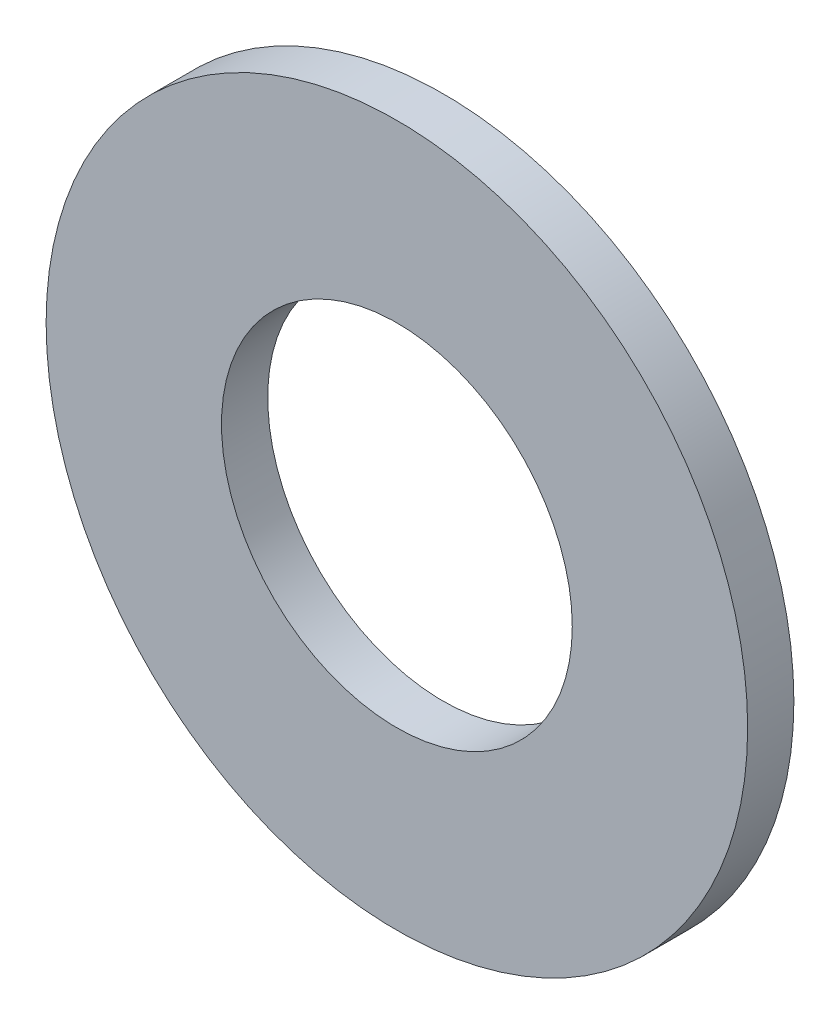
ISO-10303-21;
HEADER;
FILE_DESCRIPTION(('STEP AP214'),'2;1');
FILE_NAME('part.step','',(''),(''),'','','');
FILE_SCHEMA(('AUTOMOTIVE_DESIGN { 1 0 10303 214 1 1 1 1 }'));
ENDSEC;
DATA;
#1=APPLICATION_CONTEXT('core data for automotive mechanical design processes');
#2=APPLICATION_PROTOCOL_DEFINITION('international standard','automotive_design',2000,#1);
#3=PRODUCT_CONTEXT('',#1,'mechanical');
#4=PRODUCT('Part','Part','',(#3));
#5=PRODUCT_RELATED_PRODUCT_CATEGORY('part','',(#4));
#6=PRODUCT_DEFINITION_FORMATION('','',#4);
#7=PRODUCT_DEFINITION_CONTEXT('part definition',#1,'design');
#8=PRODUCT_DEFINITION('design','',#6,#7);
#9=PRODUCT_DEFINITION_SHAPE('','',#8);
#10=(LENGTH_UNIT() NAMED_UNIT(*) SI_UNIT(.MILLI.,.METRE.));
#11=(NAMED_UNIT(*) PLANE_ANGLE_UNIT() SI_UNIT($,.RADIAN.));
#12=(NAMED_UNIT(*) SI_UNIT($,.STERADIAN.) SOLID_ANGLE_UNIT());
#13=UNCERTAINTY_MEASURE_WITH_UNIT(LENGTH_MEASURE(1.E-05),#10,'distance_accuracy_value','');
#14=(GEOMETRIC_REPRESENTATION_CONTEXT(3) GLOBAL_UNCERTAINTY_ASSIGNED_CONTEXT((#13)) GLOBAL_UNIT_ASSIGNED_CONTEXT((#10,
#11,#12)) REPRESENTATION_CONTEXT('',''));
#15=CARTESIAN_POINT('',(0.,0.,0.));
#16=DIRECTION('',(0.,0.,1.));
#17=DIRECTION('',(1.,0.,0.));
#18=AXIS2_PLACEMENT_3D('',#15,#16,#17);
#19=CARTESIAN_POINT('',(0.,0.,-1.778));
#20=DIRECTION('',(0.,0.,1.));
#21=DIRECTION('',(1.,0.,0.));
#22=AXIS2_PLACEMENT_3D('',#19,#20,#21);
#23=CYLINDRICAL_SURFACE('',#22,13.49375);
#24=CARTESIAN_POINT('',(0.,0.,-1.778));
#25=DIRECTION('',(0.,0.,1.));
#26=DIRECTION('',(1.,0.,0.));
#27=AXIS2_PLACEMENT_3D('',#24,#25,#26);
#28=CIRCLE('',#27,13.49375);
#29=CARTESIAN_POINT('',(13.49375,0.,-1.778));
#30=VERTEX_POINT('',#29);
#31=EDGE_CURVE('E10',#30,#30,#28,.T.);
#32=ORIENTED_EDGE('',*,*,#31,.T.);
#33=EDGE_LOOP('',(#32));
#34=FACE_BOUND('',#33,.T.);
#35=CARTESIAN_POINT('',(0.,0.,0.));
#36=DIRECTION('',(0.,0.,1.));
#37=DIRECTION('',(1.,0.,0.));
#38=AXIS2_PLACEMENT_3D('',#35,#36,#37);
#39=CIRCLE('',#38,13.49375);
#40=CARTESIAN_POINT('',(13.49375,0.,0.));
#41=VERTEX_POINT('',#40);
#42=EDGE_CURVE('E39',#41,#41,#39,.T.);
#43=ORIENTED_EDGE('',*,*,#42,.F.);
#44=EDGE_LOOP('',(#43));
#45=FACE_BOUND('',#44,.T.);
#46=ADVANCED_FACE('F36',(#34,#45),#23,.T.);
#47=CARTESIAN_POINT('',(0.,0.,-1.778));
#48=DIRECTION('',(0.,0.,1.));
#49=DIRECTION('',(1.,0.,0.));
#50=AXIS2_PLACEMENT_3D('',#47,#48,#49);
#51=PLANE('',#50);
#52=CARTESIAN_POINT('',(0.,0.,-1.778));
#53=DIRECTION('',(0.,0.,1.));
#54=DIRECTION('',(1.,0.,0.));
#55=AXIS2_PLACEMENT_3D('',#52,#53,#54);
#56=CIRCLE('',#55,6.746875);
#57=CARTESIAN_POINT('',(6.746875,0.,-1.778));
#58=VERTEX_POINT('',#57);
#59=EDGE_CURVE('E46',#58,#58,#56,.T.);
#60=ORIENTED_EDGE('',*,*,#59,.T.);
#61=EDGE_LOOP('',(#60));
#62=FACE_BOUND('',#61,.T.);
#63=ORIENTED_EDGE('',*,*,#31,.F.);
#64=EDGE_LOOP('',(#63));
#65=FACE_BOUND('',#64,.T.);
#66=ADVANCED_FACE('F54',(#62,#65),#51,.F.);
#67=CARTESIAN_POINT('',(0.,0.,0.));
#68=DIRECTION('',(0.,0.,1.));
#69=DIRECTION('',(1.,0.,0.));
#70=AXIS2_PLACEMENT_3D('',#67,#68,#69);
#71=PLANE('',#70);
#72=CARTESIAN_POINT('',(0.,0.,0.));
#73=DIRECTION('',(0.,0.,1.));
#74=DIRECTION('',(1.,0.,0.));
#75=AXIS2_PLACEMENT_3D('',#72,#73,#74);
#76=CIRCLE('',#75,6.746875);
#77=CARTESIAN_POINT('',(6.746875,0.,0.));
#78=VERTEX_POINT('',#77);
#79=EDGE_CURVE('E48',#78,#78,#76,.T.);
#80=ORIENTED_EDGE('',*,*,#79,.F.);
#81=EDGE_LOOP('',(#80));
#82=FACE_BOUND('',#81,.T.);
#83=ORIENTED_EDGE('',*,*,#42,.T.);
#84=EDGE_LOOP('',(#83));
#85=FACE_BOUND('',#84,.T.);
#86=ADVANCED_FACE('F60',(#82,#85),#71,.T.);
#87=CARTESIAN_POINT('',(0.,0.,-1.778));
#88=DIRECTION('',(0.,0.,1.));
#89=DIRECTION('',(1.,0.,0.));
#90=AXIS2_PLACEMENT_3D('',#87,#88,#89);
#91=CYLINDRICAL_SURFACE('',#90,6.746875);
#92=ORIENTED_EDGE('',*,*,#59,.F.);
#93=EDGE_LOOP('',(#92));
#94=FACE_BOUND('',#93,.T.);
#95=ORIENTED_EDGE('',*,*,#79,.T.);
#96=EDGE_LOOP('',(#95));
#97=FACE_BOUND('',#96,.T.);
#98=ADVANCED_FACE('F57',(#94,#97),#91,.F.);
#99=CLOSED_SHELL('',(#46,#66,#86,#98));
#100=MANIFOLD_SOLID_BREP('B2',#99);
#101=ADVANCED_BREP_SHAPE_REPRESENTATION('',(#18,#100),#14);
#102=SHAPE_DEFINITION_REPRESENTATION(#9,#101);
ENDSEC;
END-ISO-10303-21;
